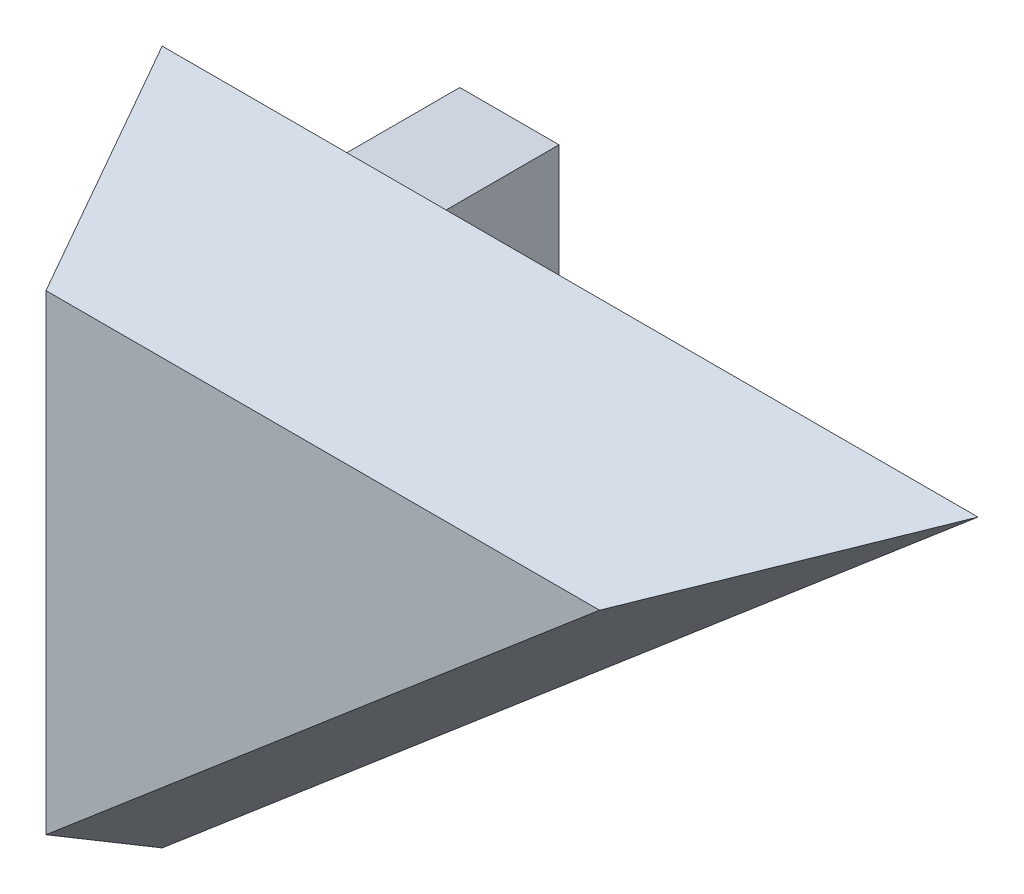
ISO-10303-21;
HEADER;
FILE_DESCRIPTION(('STEP AP214'),'2;1');
FILE_NAME('part.step','',(''),(''),'','','');
FILE_SCHEMA(('AUTOMOTIVE_DESIGN { 1 0 10303 214 1 1 1 1 }'));
ENDSEC;
DATA;
#1=APPLICATION_CONTEXT('core data for automotive mechanical design processes');
#2=APPLICATION_PROTOCOL_DEFINITION('international standard','automotive_design',2000,#1);
#3=PRODUCT_CONTEXT('',#1,'mechanical');
#4=PRODUCT('Part','Part','',(#3));
#5=PRODUCT_RELATED_PRODUCT_CATEGORY('part','',(#4));
#6=PRODUCT_DEFINITION_FORMATION('','',#4);
#7=PRODUCT_DEFINITION_CONTEXT('part definition',#1,'design');
#8=PRODUCT_DEFINITION('design','',#6,#7);
#9=PRODUCT_DEFINITION_SHAPE('','',#8);
#10=(LENGTH_UNIT() NAMED_UNIT(*) SI_UNIT(.MILLI.,.METRE.));
#11=(NAMED_UNIT(*) PLANE_ANGLE_UNIT() SI_UNIT($,.RADIAN.));
#12=(NAMED_UNIT(*) SI_UNIT($,.STERADIAN.) SOLID_ANGLE_UNIT());
#13=UNCERTAINTY_MEASURE_WITH_UNIT(LENGTH_MEASURE(1.E-05),#10,'distance_accuracy_value','');
#14=(GEOMETRIC_REPRESENTATION_CONTEXT(3) GLOBAL_UNCERTAINTY_ASSIGNED_CONTEXT((#13)) GLOBAL_UNIT_ASSIGNED_CONTEXT((#10,
#11,#12)) REPRESENTATION_CONTEXT('',''));
#15=CARTESIAN_POINT('',(0.,0.,0.));
#16=DIRECTION('',(0.,0.,1.));
#17=DIRECTION('',(1.,0.,0.));
#18=AXIS2_PLACEMENT_3D('',#15,#16,#17);
#19=CARTESIAN_POINT('',(0.,0.,0.));
#20=DIRECTION('',(0.,0.,-1.));
#21=DIRECTION('',(-1.,0.,0.));
#22=AXIS2_PLACEMENT_3D('',#19,#20,#21);
#23=PLANE('',#22);
#24=DIRECTION('',(0.761488208276801,0.6481787628852,0.));
#25=VECTOR('',#24,1.);
#26=CARTESIAN_POINT('',(59.4100986842106,45.0850000000017,0.));
#27=LINE('',#26,#25);
#28=CARTESIAN_POINT('',(46.355,33.9725000000019,0.));
#29=VERTEX_POINT('',#28);
#30=CARTESIAN_POINT('',(59.4100986842106,45.0850000000017,0.));
#31=VERTEX_POINT('',#30);
#32=EDGE_CURVE('E120',#29,#31,#27,.T.);
#33=ORIENTED_EDGE('',*,*,#32,.F.);
#34=DIRECTION('',(0.,-1.,0.));
#35=VECTOR('',#34,1.);
#36=CARTESIAN_POINT('',(46.355,33.9725000000019,0.));
#37=LINE('',#36,#35);
#38=CARTESIAN_POINT('',(46.355,45.0850000000017,0.));
#39=VERTEX_POINT('',#38);
#40=EDGE_CURVE('E130',#39,#29,#37,.T.);
#41=ORIENTED_EDGE('',*,*,#40,.F.);
#42=DIRECTION('',(-1.,0.,0.));
#43=VECTOR('',#42,1.);
#44=CARTESIAN_POINT('',(46.355,45.0850000000017,0.));
#45=LINE('',#44,#43);
#46=EDGE_CURVE('E123',#31,#39,#45,.T.);
#47=ORIENTED_EDGE('',*,*,#46,.F.);
#48=EDGE_LOOP('',(#33,#41,#47));
#49=FACE_BOUND('',#48,.T.);
#50=DIRECTION('',(-1.,0.,0.));
#51=VECTOR('',#50,1.);
#52=CARTESIAN_POINT('',(47.9425,37.3672100000018,0.));
#53=LINE('',#52,#51);
#54=CARTESIAN_POINT('',(49.53,37.3672100000018,0.));
#55=VERTEX_POINT('',#54);
#56=CARTESIAN_POINT('',(47.9425,37.3672100000018,0.));
#57=VERTEX_POINT('',#56);
#58=EDGE_CURVE('E241',#55,#57,#53,.T.);
#59=ORIENTED_EDGE('',*,*,#58,.F.);
#60=DIRECTION('',(0.,-1.,0.));
#61=VECTOR('',#60,1.);
#62=CARTESIAN_POINT('',(49.53,37.3672100000018,0.));
#63=LINE('',#62,#61);
#64=CARTESIAN_POINT('',(49.53,43.7172100000018,0.));
#65=VERTEX_POINT('',#64);
#66=EDGE_CURVE('E118',#65,#55,#63,.T.);
#67=ORIENTED_EDGE('',*,*,#66,.F.);
#68=DIRECTION('',(1.,0.,0.));
#69=VECTOR('',#68,1.);
#70=CARTESIAN_POINT('',(47.9425,43.7172100000018,0.));
#71=LINE('',#70,#69);
#72=CARTESIAN_POINT('',(47.9425,43.7172100000018,0.));
#73=VERTEX_POINT('',#72);
#74=EDGE_CURVE('E114',#73,#65,#71,.T.);
#75=ORIENTED_EDGE('',*,*,#74,.F.);
#76=DIRECTION('',(0.,1.,0.));
#77=VECTOR('',#76,1.);
#78=CARTESIAN_POINT('',(47.9425,37.3672100000018,0.));
#79=LINE('',#78,#77);
#80=EDGE_CURVE('E238',#57,#73,#79,.T.);
#81=ORIENTED_EDGE('',*,*,#80,.F.);
#82=EDGE_LOOP('',(#59,#67,#75,#81));
#83=FACE_BOUND('',#82,.T.);
#84=ADVANCED_FACE('F35',(#49,#83),#23,.T.);
#85=CARTESIAN_POINT('',(0.,0.,2.54));
#86=DIRECTION('',(0.,0.,-1.));
#87=DIRECTION('',(-1.,0.,0.));
#88=AXIS2_PLACEMENT_3D('',#85,#86,#87);
#89=PLANE('',#88);
#90=DIRECTION('',(0.,-1.,0.));
#91=VECTOR('',#90,1.);
#92=CARTESIAN_POINT('',(47.0355909487749,-2.05590535622761E-13,2.54));
#93=LINE('',#92,#91);
#94=CARTESIAN_POINT('',(47.0355909487751,43.306472852949,2.54));
#95=VERTEX_POINT('',#94);
#96=CARTESIAN_POINT('',(47.035590948775,35.7658685372959,2.54));
#97=VERTEX_POINT('',#96);
#98=EDGE_CURVE('E132',#95,#97,#93,.T.);
#99=ORIENTED_EDGE('',*,*,#98,.T.);
#100=DIRECTION('',(0.761488208276801,0.6481787628852,0.));
#101=VECTOR('',#100,1.);
#102=CARTESIAN_POINT('',(2.10799660362435,-2.47649976929558,2.54));
#103=LINE('',#102,#101);
#104=CARTESIAN_POINT('',(55.8943836128414,43.306472852949,2.54));
#105=VERTEX_POINT('',#104);
#106=EDGE_CURVE('E138',#97,#105,#103,.T.);
#107=ORIENTED_EDGE('',*,*,#106,.T.);
#108=DIRECTION('',(-1.,0.,0.));
#109=VECTOR('',#108,1.);
#110=CARTESIAN_POINT('',(0.,43.3064728529489,2.54));
#111=LINE('',#110,#109);
#112=EDGE_CURVE('E134',#105,#95,#111,.T.);
#113=ORIENTED_EDGE('',*,*,#112,.T.);
#114=EDGE_LOOP('',(#99,#107,#113));
#115=FACE_BOUND('',#114,.T.);
#116=ADVANCED_FACE('F151',(#115),#89,.F.);
#117=CARTESIAN_POINT('',(47.0355909487749,-2.05590535622761E-13,2.54));
#118=DIRECTION('',(0.965925826289069,0.,-0.258819045102519));
#119=DIRECTION('',(0.,-1.,0.));
#120=AXIS2_PLACEMENT_3D('',#117,#118,#119);
#121=PLANE('',#120);
#122=ORIENTED_EDGE('',*,*,#40,.T.);
#123=DIRECTION('',(0.21382602010941,0.563435140607136,0.79800957102856));
#124=VECTOR('',#123,1.);
#125=CARTESIAN_POINT('',(42.7266230535375,24.4116660380748,-13.5412871132095));
#126=LINE('',#125,#124);
#127=EDGE_CURVE('E11',#29,#97,#126,.T.);
#128=ORIENTED_EDGE('',*,*,#127,.T.);
#129=ORIENTED_EDGE('',*,*,#98,.F.);
#130=DIRECTION('',(-0.214387664158801,0.56024001110492,-0.800105655156675));
#131=VECTOR('',#130,1.);
#132=CARTESIAN_POINT('',(52.2370684939554,29.7139191530529,21.9521784730419));
#133=LINE('',#132,#131);
#134=EDGE_CURVE('E136',#95,#39,#133,.T.);
#135=ORIENTED_EDGE('',*,*,#134,.T.);
#136=EDGE_LOOP('',(#122,#128,#129,#135));
#137=FACE_BOUND('',#136,.T.);
#138=ADVANCED_FACE('F152',(#137),#121,.F.);
#139=CARTESIAN_POINT('',(0.,43.3064728529489,2.54));
#140=DIRECTION('',(0.,-0.819152044288993,-0.573576436351045));
#141=DIRECTION('',(-1.,0.,0.));
#142=AXIS2_PLACEMENT_3D('',#139,#140,#141);
#143=PLANE('',#142);
#144=ORIENTED_EDGE('',*,*,#112,.F.);
#145=DIRECTION('',(0.74997902498507,0.37939879329771,-0.541837630408488));
#146=VECTOR('',#145,1.);
#147=CARTESIAN_POINT('',(24.4555513843234,27.4022213834812,25.2536250348459));
#148=LINE('',#147,#146);
#149=EDGE_CURVE('E44',#105,#31,#148,.T.);
#150=ORIENTED_EDGE('',*,*,#149,.T.);
#151=ORIENTED_EDGE('',*,*,#46,.T.);
#152=ORIENTED_EDGE('',*,*,#134,.F.);
#153=EDGE_LOOP('',(#144,#150,#151,#152));
#154=FACE_BOUND('',#153,.T.);
#155=ADVANCED_FACE('F143',(#154),#143,.F.);
#156=CARTESIAN_POINT('',(2.10799660362435,-2.47649976929558,2.54));
#157=DIRECTION('',(-0.609088800433363,0.715564850133194,-0.342020143325664));
#158=DIRECTION('',(0.761488208276801,0.6481787628852,0.));
#159=AXIS2_PLACEMENT_3D('',#156,#157,#158);
#160=PLANE('',#159);
#161=ORIENTED_EDGE('',*,*,#127,.F.);
#162=ORIENTED_EDGE('',*,*,#32,.T.);
#163=ORIENTED_EDGE('',*,*,#149,.F.);
#164=ORIENTED_EDGE('',*,*,#106,.F.);
#165=EDGE_LOOP('',(#161,#162,#163,#164));
#166=FACE_BOUND('',#165,.T.);
#167=ADVANCED_FACE('F38',(#166),#160,.F.);
#168=CARTESIAN_POINT('',(49.53,37.3672100000018,-3.175));
#169=DIRECTION('',(-1.,0.,0.));
#170=DIRECTION('',(0.,0.,1.));
#171=AXIS2_PLACEMENT_3D('',#168,#169,#170);
#172=PLANE('',#171);
#173=ORIENTED_EDGE('',*,*,#66,.T.);
#174=DIRECTION('',(0.,0.,1.));
#175=VECTOR('',#174,1.);
#176=CARTESIAN_POINT('',(49.53,37.3672100000018,-3.175));
#177=LINE('',#176,#175);
#178=CARTESIAN_POINT('',(49.53,37.3672100000018,-3.175));
#179=VERTEX_POINT('',#178);
#180=EDGE_CURVE('E99',#179,#55,#177,.T.);
#181=ORIENTED_EDGE('',*,*,#180,.F.);
#182=DIRECTION('',(0.,-1.,0.));
#183=VECTOR('',#182,1.);
#184=CARTESIAN_POINT('',(49.53,37.3672100000018,-3.175));
#185=LINE('',#184,#183);
#186=CARTESIAN_POINT('',(49.53,43.7172100000018,-3.175));
#187=VERTEX_POINT('',#186);
#188=EDGE_CURVE('E106',#187,#179,#185,.T.);
#189=ORIENTED_EDGE('',*,*,#188,.F.);
#190=DIRECTION('',(0.,0.,1.));
#191=VECTOR('',#190,1.);
#192=CARTESIAN_POINT('',(49.53,43.7172100000018,-3.175));
#193=LINE('',#192,#191);
#194=EDGE_CURVE('E236',#187,#65,#193,.T.);
#195=ORIENTED_EDGE('',*,*,#194,.T.);
#196=EDGE_LOOP('',(#173,#181,#189,#195));
#197=FACE_BOUND('',#196,.T.);
#198=ADVANCED_FACE('F116',(#197),#172,.F.);
#199=CARTESIAN_POINT('',(47.9425,37.3672100000018,-3.175));
#200=DIRECTION('',(0.,1.,0.));
#201=DIRECTION('',(0.,0.,1.));
#202=AXIS2_PLACEMENT_3D('',#199,#200,#201);
#203=PLANE('',#202);
#204=ORIENTED_EDGE('',*,*,#58,.T.);
#205=DIRECTION('',(0.,0.,1.));
#206=VECTOR('',#205,1.);
#207=CARTESIAN_POINT('',(47.9425,37.3672100000018,-3.175));
#208=LINE('',#207,#206);
#209=CARTESIAN_POINT('',(47.9425,37.3672100000018,-3.175));
#210=VERTEX_POINT('',#209);
#211=EDGE_CURVE('E102',#210,#57,#208,.T.);
#212=ORIENTED_EDGE('',*,*,#211,.F.);
#213=DIRECTION('',(-1.,0.,0.));
#214=VECTOR('',#213,1.);
#215=CARTESIAN_POINT('',(47.9425,37.3672100000018,-3.175));
#216=LINE('',#215,#214);
#217=EDGE_CURVE('E95',#179,#210,#216,.T.);
#218=ORIENTED_EDGE('',*,*,#217,.F.);
#219=ORIENTED_EDGE('',*,*,#180,.T.);
#220=EDGE_LOOP('',(#204,#212,#218,#219));
#221=FACE_BOUND('',#220,.T.);
#222=ADVANCED_FACE('F97',(#221),#203,.F.);
#223=CARTESIAN_POINT('',(47.9425,37.3672100000018,-3.175));
#224=DIRECTION('',(1.,0.,0.));
#225=DIRECTION('',(0.,0.,-1.));
#226=AXIS2_PLACEMENT_3D('',#223,#224,#225);
#227=PLANE('',#226);
#228=ORIENTED_EDGE('',*,*,#80,.T.);
#229=DIRECTION('',(0.,0.,1.));
#230=VECTOR('',#229,1.);
#231=CARTESIAN_POINT('',(47.9425,43.7172100000018,-3.175));
#232=LINE('',#231,#230);
#233=CARTESIAN_POINT('',(47.9425,43.7172100000018,-3.175));
#234=VERTEX_POINT('',#233);
#235=EDGE_CURVE('E51',#234,#73,#232,.T.);
#236=ORIENTED_EDGE('',*,*,#235,.F.);
#237=DIRECTION('',(0.,1.,0.));
#238=VECTOR('',#237,1.);
#239=CARTESIAN_POINT('',(47.9425,37.3672100000018,-3.175));
#240=LINE('',#239,#238);
#241=EDGE_CURVE('E105',#210,#234,#240,.T.);
#242=ORIENTED_EDGE('',*,*,#241,.F.);
#243=ORIENTED_EDGE('',*,*,#211,.T.);
#244=EDGE_LOOP('',(#228,#236,#242,#243));
#245=FACE_BOUND('',#244,.T.);
#246=ADVANCED_FACE('F170',(#245),#227,.F.);
#247=CARTESIAN_POINT('',(47.9425,43.7172100000018,-3.175));
#248=DIRECTION('',(0.,-1.,0.));
#249=DIRECTION('',(0.,0.,-1.));
#250=AXIS2_PLACEMENT_3D('',#247,#248,#249);
#251=PLANE('',#250);
#252=ORIENTED_EDGE('',*,*,#74,.T.);
#253=ORIENTED_EDGE('',*,*,#194,.F.);
#254=DIRECTION('',(1.,0.,0.));
#255=VECTOR('',#254,1.);
#256=CARTESIAN_POINT('',(47.9425,43.7172100000018,-3.175));
#257=LINE('',#256,#255);
#258=EDGE_CURVE('E110',#234,#187,#257,.T.);
#259=ORIENTED_EDGE('',*,*,#258,.F.);
#260=ORIENTED_EDGE('',*,*,#235,.T.);
#261=EDGE_LOOP('',(#252,#253,#259,#260));
#262=FACE_BOUND('',#261,.T.);
#263=ADVANCED_FACE('F173',(#262),#251,.F.);
#264=CARTESIAN_POINT('',(0.,0.,-3.175));
#265=DIRECTION('',(0.,0.,-1.));
#266=DIRECTION('',(-1.,0.,0.));
#267=AXIS2_PLACEMENT_3D('',#264,#265,#266);
#268=PLANE('',#267);
#269=ORIENTED_EDGE('',*,*,#188,.T.);
#270=ORIENTED_EDGE('',*,*,#217,.T.);
#271=ORIENTED_EDGE('',*,*,#241,.T.);
#272=ORIENTED_EDGE('',*,*,#258,.T.);
#273=EDGE_LOOP('',(#269,#270,#271,#272));
#274=FACE_BOUND('',#273,.T.);
#275=ADVANCED_FACE('F109',(#274),#268,.T.);
#276=CLOSED_SHELL('',(#84,#116,#138,#155,#167,#198,#222,#246,#263,#275));
#277=MANIFOLD_SOLID_BREP('B2',#276);
#278=ADVANCED_BREP_SHAPE_REPRESENTATION('',(#18,#277),#14);
#279=SHAPE_DEFINITION_REPRESENTATION(#9,#278);
ENDSEC;
END-ISO-10303-21;
